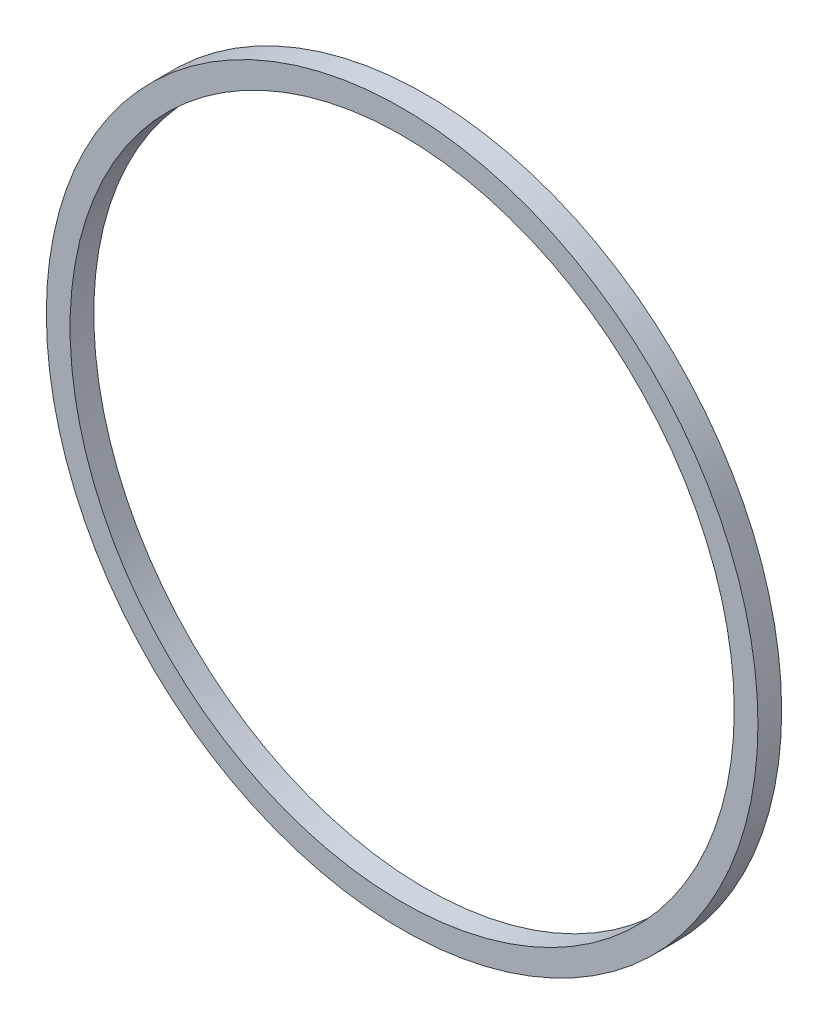
ISO-10303-21;
HEADER;
FILE_DESCRIPTION(('STEP AP214'),'2;1');
FILE_NAME('part.step','',(''),(''),'','','');
FILE_SCHEMA(('AUTOMOTIVE_DESIGN { 1 0 10303 214 1 1 1 1 }'));
ENDSEC;
DATA;
#1=APPLICATION_CONTEXT('core data for automotive mechanical design processes');
#2=APPLICATION_PROTOCOL_DEFINITION('international standard','automotive_design',2000,#1);
#3=PRODUCT_CONTEXT('',#1,'mechanical');
#4=PRODUCT('Part','Part','',(#3));
#5=PRODUCT_RELATED_PRODUCT_CATEGORY('part','',(#4));
#6=PRODUCT_DEFINITION_FORMATION('','',#4);
#7=PRODUCT_DEFINITION_CONTEXT('part definition',#1,'design');
#8=PRODUCT_DEFINITION('design','',#6,#7);
#9=PRODUCT_DEFINITION_SHAPE('','',#8);
#10=(LENGTH_UNIT() NAMED_UNIT(*) SI_UNIT(.MILLI.,.METRE.));
#11=(NAMED_UNIT(*) PLANE_ANGLE_UNIT() SI_UNIT($,.RADIAN.));
#12=(NAMED_UNIT(*) SI_UNIT($,.STERADIAN.) SOLID_ANGLE_UNIT());
#13=UNCERTAINTY_MEASURE_WITH_UNIT(LENGTH_MEASURE(1.E-05),#10,'distance_accuracy_value','');
#14=(GEOMETRIC_REPRESENTATION_CONTEXT(3) GLOBAL_UNCERTAINTY_ASSIGNED_CONTEXT((#13)) GLOBAL_UNIT_ASSIGNED_CONTEXT((#10,
#11,#12)) REPRESENTATION_CONTEXT('',''));
#15=CARTESIAN_POINT('',(0.,0.,0.));
#16=DIRECTION('',(0.,0.,1.));
#17=DIRECTION('',(1.,0.,0.));
#18=AXIS2_PLACEMENT_3D('',#15,#16,#17);
#19=CARTESIAN_POINT('',(0.,0.,2.));
#20=DIRECTION('',(0.,0.,1.));
#21=DIRECTION('',(1.,0.,0.));
#22=AXIS2_PLACEMENT_3D('',#19,#20,#21);
#23=PLANE('',#22);
#24=CARTESIAN_POINT('',(0.,0.,2.));
#25=DIRECTION('',(0.,0.,1.));
#26=DIRECTION('',(1.,0.,0.));
#27=AXIS2_PLACEMENT_3D('',#24,#25,#26);
#28=CIRCLE('',#27,30.);
#29=CARTESIAN_POINT('',(30.,0.,2.));
#30=VERTEX_POINT('',#29);
#31=EDGE_CURVE('E10',#30,#30,#28,.T.);
#32=ORIENTED_EDGE('',*,*,#31,.T.);
#33=EDGE_LOOP('',(#32));
#34=FACE_BOUND('',#33,.T.);
#35=CARTESIAN_POINT('',(0.,0.,2.));
#36=DIRECTION('',(0.,0.,1.));
#37=DIRECTION('',(1.,0.,0.));
#38=AXIS2_PLACEMENT_3D('',#35,#36,#37);
#39=CIRCLE('',#38,28.);
#40=CARTESIAN_POINT('',(28.,0.,2.));
#41=VERTEX_POINT('',#40);
#42=EDGE_CURVE('E52',#41,#41,#39,.T.);
#43=ORIENTED_EDGE('',*,*,#42,.F.);
#44=EDGE_LOOP('',(#43));
#45=FACE_BOUND('',#44,.T.);
#46=ADVANCED_FACE('F41',(#34,#45),#23,.T.);
#47=CARTESIAN_POINT('',(0.,0.,0.));
#48=DIRECTION('',(0.,0.,1.));
#49=DIRECTION('',(1.,0.,0.));
#50=AXIS2_PLACEMENT_3D('',#47,#48,#49);
#51=PLANE('',#50);
#52=CARTESIAN_POINT('',(0.,0.,0.));
#53=DIRECTION('',(0.,0.,1.));
#54=DIRECTION('',(1.,0.,0.));
#55=AXIS2_PLACEMENT_3D('',#52,#53,#54);
#56=CIRCLE('',#55,30.);
#57=CARTESIAN_POINT('',(30.,0.,0.));
#58=VERTEX_POINT('',#57);
#59=EDGE_CURVE('E45',#58,#58,#56,.T.);
#60=ORIENTED_EDGE('',*,*,#59,.F.);
#61=EDGE_LOOP('',(#60));
#62=FACE_BOUND('',#61,.T.);
#63=CARTESIAN_POINT('',(0.,0.,0.));
#64=DIRECTION('',(0.,0.,1.));
#65=DIRECTION('',(1.,0.,0.));
#66=AXIS2_PLACEMENT_3D('',#63,#64,#65);
#67=CIRCLE('',#66,28.);
#68=CARTESIAN_POINT('',(28.,0.,0.));
#69=VERTEX_POINT('',#68);
#70=EDGE_CURVE('E54',#69,#69,#67,.T.);
#71=ORIENTED_EDGE('',*,*,#70,.T.);
#72=EDGE_LOOP('',(#71));
#73=FACE_BOUND('',#72,.T.);
#74=ADVANCED_FACE('F64',(#62,#73),#51,.F.);
#75=CARTESIAN_POINT('',(0.,0.,2.));
#76=DIRECTION('',(0.,0.,-1.));
#77=DIRECTION('',(-1.,0.,0.));
#78=AXIS2_PLACEMENT_3D('',#75,#76,#77);
#79=CYLINDRICAL_SURFACE('',#78,30.);
#80=ORIENTED_EDGE('',*,*,#31,.F.);
#81=EDGE_LOOP('',(#80));
#82=FACE_BOUND('',#81,.T.);
#83=ORIENTED_EDGE('',*,*,#59,.T.);
#84=EDGE_LOOP('',(#83));
#85=FACE_BOUND('',#84,.T.);
#86=ADVANCED_FACE('F43',(#82,#85),#79,.T.);
#87=CARTESIAN_POINT('',(0.,0.,2.));
#88=DIRECTION('',(0.,0.,-1.));
#89=DIRECTION('',(-1.,0.,0.));
#90=AXIS2_PLACEMENT_3D('',#87,#88,#89);
#91=CYLINDRICAL_SURFACE('',#90,28.);
#92=ORIENTED_EDGE('',*,*,#42,.T.);
#93=EDGE_LOOP('',(#92));
#94=FACE_BOUND('',#93,.T.);
#95=ORIENTED_EDGE('',*,*,#70,.F.);
#96=EDGE_LOOP('',(#95));
#97=FACE_BOUND('',#96,.T.);
#98=ADVANCED_FACE('F60',(#94,#97),#91,.F.);
#99=CLOSED_SHELL('',(#46,#74,#86,#98));
#100=MANIFOLD_SOLID_BREP('B2',#99);
#101=ADVANCED_BREP_SHAPE_REPRESENTATION('',(#18,#100),#14);
#102=SHAPE_DEFINITION_REPRESENTATION(#9,#101);
ENDSEC;
END-ISO-10303-21;
